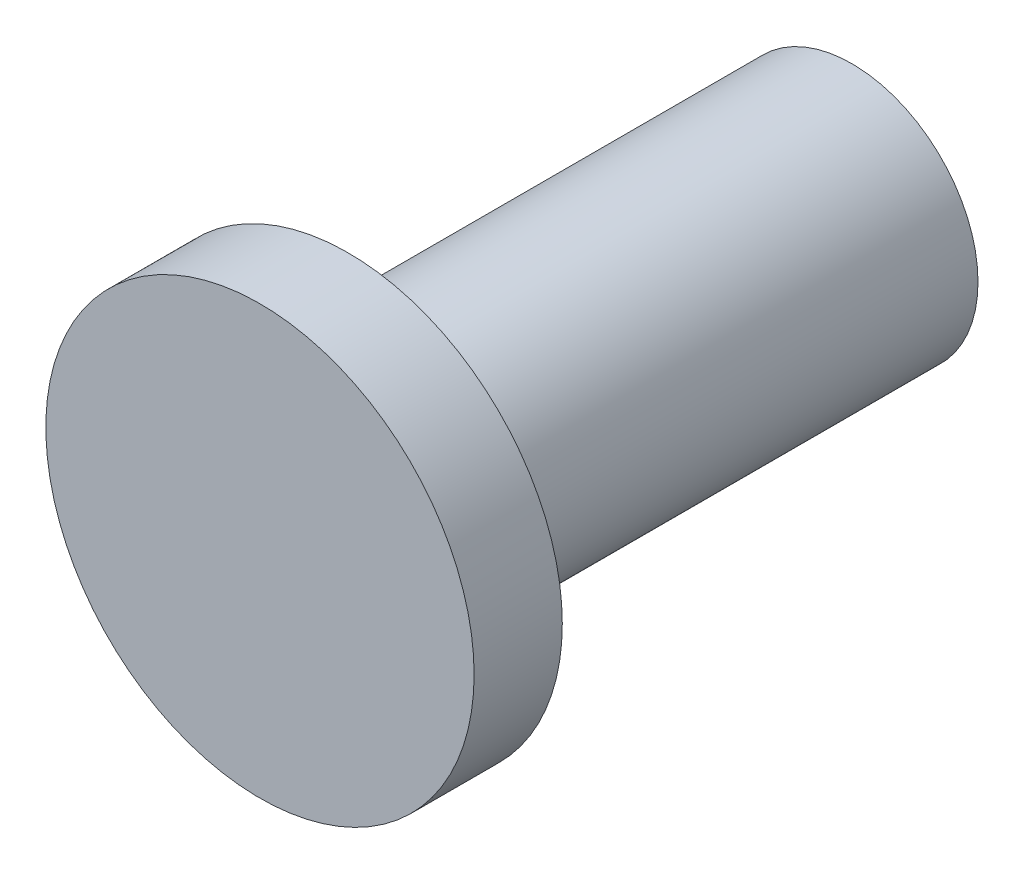
ISO-10303-21;
HEADER;
FILE_DESCRIPTION(('STEP AP214'),'2;1');
FILE_NAME('part.step','',(''),(''),'','','');
FILE_SCHEMA(('AUTOMOTIVE_DESIGN { 1 0 10303 214 1 1 1 1 }'));
ENDSEC;
DATA;
#1=APPLICATION_CONTEXT('core data for automotive mechanical design processes');
#2=APPLICATION_PROTOCOL_DEFINITION('international standard','automotive_design',2000,#1);
#3=PRODUCT_CONTEXT('',#1,'mechanical');
#4=PRODUCT('Part','Part','',(#3));
#5=PRODUCT_RELATED_PRODUCT_CATEGORY('part','',(#4));
#6=PRODUCT_DEFINITION_FORMATION('','',#4);
#7=PRODUCT_DEFINITION_CONTEXT('part definition',#1,'design');
#8=PRODUCT_DEFINITION('design','',#6,#7);
#9=PRODUCT_DEFINITION_SHAPE('','',#8);
#10=(LENGTH_UNIT() NAMED_UNIT(*) SI_UNIT(.MILLI.,.METRE.));
#11=(NAMED_UNIT(*) PLANE_ANGLE_UNIT() SI_UNIT($,.RADIAN.));
#12=(NAMED_UNIT(*) SI_UNIT($,.STERADIAN.) SOLID_ANGLE_UNIT());
#13=UNCERTAINTY_MEASURE_WITH_UNIT(LENGTH_MEASURE(1.E-05),#10,'distance_accuracy_value','');
#14=(GEOMETRIC_REPRESENTATION_CONTEXT(3) GLOBAL_UNCERTAINTY_ASSIGNED_CONTEXT((#13)) GLOBAL_UNIT_ASSIGNED_CONTEXT((#10,
#11,#12)) REPRESENTATION_CONTEXT('',''));
#15=CARTESIAN_POINT('',(0.,0.,0.));
#16=DIRECTION('',(0.,0.,1.));
#17=DIRECTION('',(1.,0.,0.));
#18=AXIS2_PLACEMENT_3D('',#15,#16,#17);
#19=CARTESIAN_POINT('',(0.,0.,0.));
#20=DIRECTION('',(0.,0.,-1.));
#21=DIRECTION('',(-1.,0.,0.));
#22=AXIS2_PLACEMENT_3D('',#19,#20,#21);
#23=CYLINDRICAL_SURFACE('',#22,1.);
#24=CARTESIAN_POINT('',(0.,0.,0.));
#25=DIRECTION('',(0.,0.,1.));
#26=DIRECTION('',(1.,0.,0.));
#27=AXIS2_PLACEMENT_3D('',#24,#25,#26);
#28=CIRCLE('',#27,1.);
#29=CARTESIAN_POINT('',(1.,0.,0.));
#30=VERTEX_POINT('',#29);
#31=EDGE_CURVE('E10',#30,#30,#28,.T.);
#32=ORIENTED_EDGE('',*,*,#31,.F.);
#33=EDGE_LOOP('',(#32));
#34=FACE_BOUND('',#33,.T.);
#35=CARTESIAN_POINT('',(0.,0.,-4.));
#36=DIRECTION('',(0.,0.,1.));
#37=DIRECTION('',(1.,0.,0.));
#38=AXIS2_PLACEMENT_3D('',#35,#36,#37);
#39=CIRCLE('',#38,1.);
#40=CARTESIAN_POINT('',(1.,0.,-4.));
#41=VERTEX_POINT('',#40);
#42=EDGE_CURVE('E45',#41,#41,#39,.T.);
#43=ORIENTED_EDGE('',*,*,#42,.T.);
#44=EDGE_LOOP('',(#43));
#45=FACE_BOUND('',#44,.T.);
#46=ADVANCED_FACE('F39',(#34,#45),#23,.T.);
#47=CARTESIAN_POINT('',(0.,0.,-4.));
#48=DIRECTION('',(0.,0.,1.));
#49=DIRECTION('',(1.,0.,0.));
#50=AXIS2_PLACEMENT_3D('',#47,#48,#49);
#51=PLANE('',#50);
#52=ORIENTED_EDGE('',*,*,#42,.F.);
#53=EDGE_LOOP('',(#52));
#54=FACE_BOUND('',#53,.T.);
#55=ADVANCED_FACE('F62',(#54),#51,.F.);
#56=CARTESIAN_POINT('',(0.,0.,0.7));
#57=DIRECTION('',(0.,0.,-1.));
#58=DIRECTION('',(-1.,0.,0.));
#59=AXIS2_PLACEMENT_3D('',#56,#57,#58);
#60=CYLINDRICAL_SURFACE('',#59,1.7);
#61=CARTESIAN_POINT('',(0.,0.,0.7));
#62=DIRECTION('',(0.,0.,1.));
#63=DIRECTION('',(1.,0.,0.));
#64=AXIS2_PLACEMENT_3D('',#61,#62,#63);
#65=CIRCLE('',#64,1.7);
#66=CARTESIAN_POINT('',(1.7,0.,0.7));
#67=VERTEX_POINT('',#66);
#68=EDGE_CURVE('E47',#67,#67,#65,.T.);
#69=ORIENTED_EDGE('',*,*,#68,.F.);
#70=EDGE_LOOP('',(#69));
#71=FACE_BOUND('',#70,.T.);
#72=CARTESIAN_POINT('',(0.,0.,0.));
#73=DIRECTION('',(0.,0.,1.));
#74=DIRECTION('',(1.,0.,0.));
#75=AXIS2_PLACEMENT_3D('',#72,#73,#74);
#76=CIRCLE('',#75,1.7);
#77=CARTESIAN_POINT('',(1.7,0.,0.));
#78=VERTEX_POINT('',#77);
#79=EDGE_CURVE('E51',#78,#78,#76,.T.);
#80=ORIENTED_EDGE('',*,*,#79,.T.);
#81=EDGE_LOOP('',(#80));
#82=FACE_BOUND('',#81,.T.);
#83=ADVANCED_FACE('F56',(#71,#82),#60,.T.);
#84=CARTESIAN_POINT('',(0.,0.,0.7));
#85=DIRECTION('',(0.,0.,1.));
#86=DIRECTION('',(1.,0.,0.));
#87=AXIS2_PLACEMENT_3D('',#84,#85,#86);
#88=PLANE('',#87);
#89=ORIENTED_EDGE('',*,*,#68,.T.);
#90=EDGE_LOOP('',(#89));
#91=FACE_BOUND('',#90,.T.);
#92=ADVANCED_FACE('F60',(#91),#88,.T.);
#93=CARTESIAN_POINT('',(0.,0.,0.));
#94=DIRECTION('',(0.,0.,1.));
#95=DIRECTION('',(1.,0.,0.));
#96=AXIS2_PLACEMENT_3D('',#93,#94,#95);
#97=PLANE('',#96);
#98=ORIENTED_EDGE('',*,*,#31,.T.);
#99=EDGE_LOOP('',(#98));
#100=FACE_BOUND('',#99,.T.);
#101=ORIENTED_EDGE('',*,*,#79,.F.);
#102=EDGE_LOOP('',(#101));
#103=FACE_BOUND('',#102,.T.);
#104=ADVANCED_FACE('F68',(#100,#103),#97,.F.);
#105=CLOSED_SHELL('',(#46,#55,#83,#92,#104));
#106=MANIFOLD_SOLID_BREP('B2',#105);
#107=ADVANCED_BREP_SHAPE_REPRESENTATION('',(#18,#106),#14);
#108=SHAPE_DEFINITION_REPRESENTATION(#9,#107);
ENDSEC;
END-ISO-10303-21;
